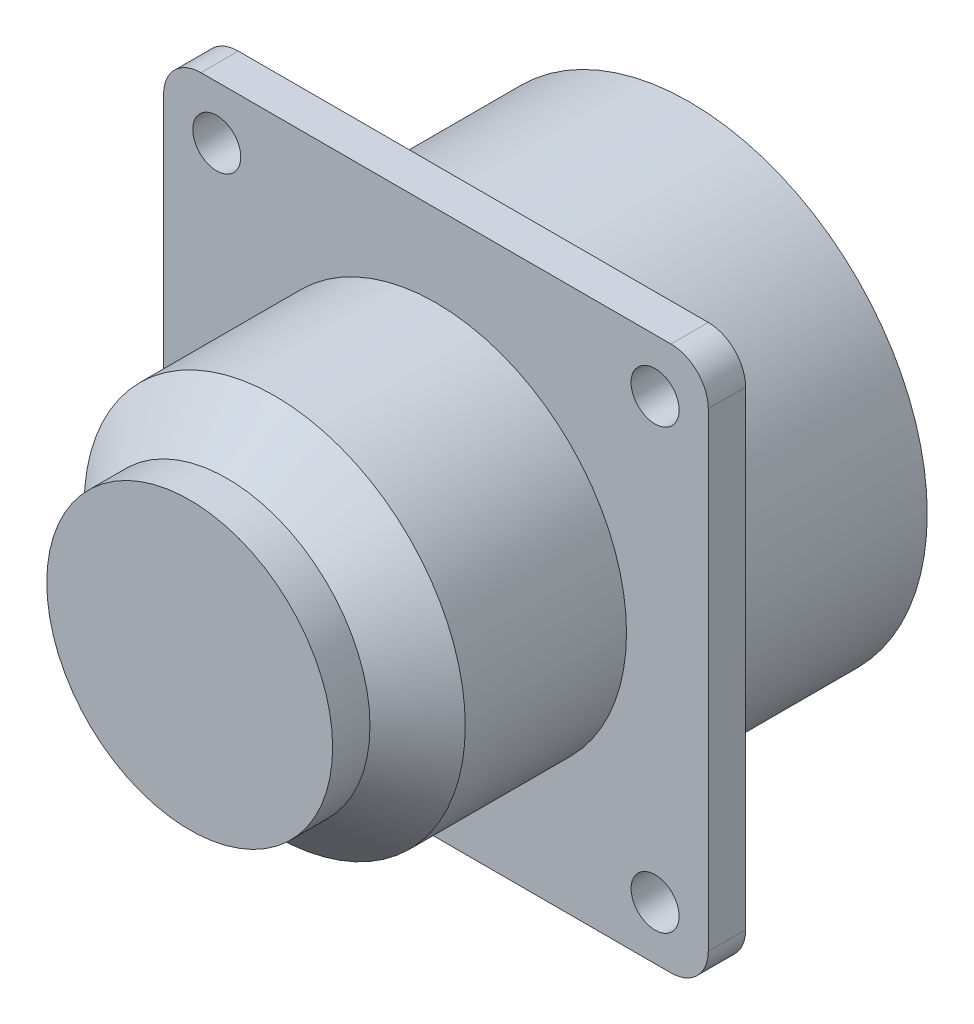
ISO-10303-21;
HEADER;
FILE_DESCRIPTION(('STEP AP214'),'2;1');
FILE_NAME('part.step','',(''),(''),'','','');
FILE_SCHEMA(('AUTOMOTIVE_DESIGN { 1 0 10303 214 1 1 1 1 }'));
ENDSEC;
DATA;
#1=APPLICATION_CONTEXT('core data for automotive mechanical design processes');
#2=APPLICATION_PROTOCOL_DEFINITION('international standard','automotive_design',2000,#1);
#3=PRODUCT_CONTEXT('',#1,'mechanical');
#4=PRODUCT('Part','Part','',(#3));
#5=PRODUCT_RELATED_PRODUCT_CATEGORY('part','',(#4));
#6=PRODUCT_DEFINITION_FORMATION('','',#4);
#7=PRODUCT_DEFINITION_CONTEXT('part definition',#1,'design');
#8=PRODUCT_DEFINITION('design','',#6,#7);
#9=PRODUCT_DEFINITION_SHAPE('','',#8);
#10=(LENGTH_UNIT() NAMED_UNIT(*) SI_UNIT(.MILLI.,.METRE.));
#11=(NAMED_UNIT(*) PLANE_ANGLE_UNIT() SI_UNIT($,.RADIAN.));
#12=(NAMED_UNIT(*) SI_UNIT($,.STERADIAN.) SOLID_ANGLE_UNIT());
#13=UNCERTAINTY_MEASURE_WITH_UNIT(LENGTH_MEASURE(1.E-05),#10,'distance_accuracy_value','');
#14=(GEOMETRIC_REPRESENTATION_CONTEXT(3) GLOBAL_UNCERTAINTY_ASSIGNED_CONTEXT((#13)) GLOBAL_UNIT_ASSIGNED_CONTEXT((#10,
#11,#12)) REPRESENTATION_CONTEXT('',''));
#15=CARTESIAN_POINT('',(0.,0.,0.));
#16=DIRECTION('',(0.,0.,1.));
#17=DIRECTION('',(1.,0.,0.));
#18=AXIS2_PLACEMENT_3D('',#15,#16,#17);
#19=CARTESIAN_POINT('',(0.,25.4,2.4892));
#20=DIRECTION('',(0.,0.,1.));
#21=DIRECTION('',(1.,0.,0.));
#22=AXIS2_PLACEMENT_3D('',#19,#20,#21);
#23=PLANE('',#22);
#24=CARTESIAN_POINT('',(-14.605,-14.605,2.4892));
#25=DIRECTION('',(0.,0.,1.));
#26=DIRECTION('',(1.,0.,0.));
#27=AXIS2_PLACEMENT_3D('',#24,#25,#26);
#28=CIRCLE('',#27,1.6002);
#29=CARTESIAN_POINT('',(-13.0048,-14.605,2.4892));
#30=VERTEX_POINT('',#29);
#31=EDGE_CURVE('E205',#30,#30,#28,.F.);
#32=ORIENTED_EDGE('',*,*,#31,.T.);
#33=EDGE_LOOP('',(#32));
#34=FACE_BOUND('',#33,.T.);
#35=CARTESIAN_POINT('',(-14.605,14.605,2.4892));
#36=DIRECTION('',(0.,0.,1.));
#37=DIRECTION('',(1.,0.,0.));
#38=AXIS2_PLACEMENT_3D('',#35,#36,#37);
#39=CIRCLE('',#38,1.6002);
#40=CARTESIAN_POINT('',(-13.0048,14.605,2.4892));
#41=VERTEX_POINT('',#40);
#42=EDGE_CURVE('E116',#41,#41,#39,.F.);
#43=ORIENTED_EDGE('',*,*,#42,.T.);
#44=EDGE_LOOP('',(#43));
#45=FACE_BOUND('',#44,.T.);
#46=CARTESIAN_POINT('',(15.6591,15.6591,2.4892));
#47=DIRECTION('',(0.,0.,1.));
#48=DIRECTION('',(1.,0.,0.));
#49=AXIS2_PLACEMENT_3D('',#46,#47,#48);
#50=CIRCLE('',#49,2.4892);
#51=CARTESIAN_POINT('',(15.6591,18.1483,2.4892));
#52=VERTEX_POINT('',#51);
#53=CARTESIAN_POINT('',(18.1483,15.6591,2.4892));
#54=VERTEX_POINT('',#53);
#55=EDGE_CURVE('E163',#52,#54,#50,.F.);
#56=ORIENTED_EDGE('',*,*,#55,.F.);
#57=DIRECTION('',(1.,0.,0.));
#58=VECTOR('',#57,1.);
#59=CARTESIAN_POINT('',(0.,18.1483,2.4892));
#60=LINE('',#59,#58);
#61=CARTESIAN_POINT('',(-15.6591,18.1483,2.4892));
#62=VERTEX_POINT('',#61);
#63=EDGE_CURVE('E105',#62,#52,#60,.T.);
#64=ORIENTED_EDGE('',*,*,#63,.F.);
#65=CARTESIAN_POINT('',(-15.6591,15.6591,2.4892));
#66=DIRECTION('',(0.,0.,1.));
#67=DIRECTION('',(1.,0.,0.));
#68=AXIS2_PLACEMENT_3D('',#65,#66,#67);
#69=CIRCLE('',#68,2.4892);
#70=CARTESIAN_POINT('',(-18.1483,15.6591,2.4892));
#71=VERTEX_POINT('',#70);
#72=EDGE_CURVE('E160',#71,#62,#69,.F.);
#73=ORIENTED_EDGE('',*,*,#72,.F.);
#74=DIRECTION('',(0.,1.,0.));
#75=VECTOR('',#74,1.);
#76=CARTESIAN_POINT('',(-18.1483,25.4,2.4892));
#77=LINE('',#76,#75);
#78=CARTESIAN_POINT('',(-18.1483,-15.6591,2.4892));
#79=VERTEX_POINT('',#78);
#80=EDGE_CURVE('E158',#79,#71,#77,.T.);
#81=ORIENTED_EDGE('',*,*,#80,.F.);
#82=CARTESIAN_POINT('',(-15.6591,-15.6591,2.4892));
#83=DIRECTION('',(0.,0.,1.));
#84=DIRECTION('',(1.,0.,0.));
#85=AXIS2_PLACEMENT_3D('',#82,#83,#84);
#86=CIRCLE('',#85,2.4892);
#87=CARTESIAN_POINT('',(-15.6591,-18.1483,2.4892));
#88=VERTEX_POINT('',#87);
#89=EDGE_CURVE('E156',#88,#79,#86,.F.);
#90=ORIENTED_EDGE('',*,*,#89,.F.);
#91=DIRECTION('',(-1.,0.,0.));
#92=VECTOR('',#91,1.);
#93=CARTESIAN_POINT('',(0.,-18.1483,2.4892));
#94=LINE('',#93,#92);
#95=CARTESIAN_POINT('',(15.6591,-18.1483,2.4892));
#96=VERTEX_POINT('',#95);
#97=EDGE_CURVE('E154',#96,#88,#94,.T.);
#98=ORIENTED_EDGE('',*,*,#97,.F.);
#99=CARTESIAN_POINT('',(15.6591,-15.6591,2.4892));
#100=DIRECTION('',(0.,0.,1.));
#101=DIRECTION('',(1.,0.,0.));
#102=AXIS2_PLACEMENT_3D('',#99,#100,#101);
#103=CIRCLE('',#102,2.48919999999999);
#104=CARTESIAN_POINT('',(18.1483,-15.6591,2.4892));
#105=VERTEX_POINT('',#104);
#106=EDGE_CURVE('E152',#105,#96,#103,.F.);
#107=ORIENTED_EDGE('',*,*,#106,.F.);
#108=DIRECTION('',(0.,-1.,0.));
#109=VECTOR('',#108,1.);
#110=CARTESIAN_POINT('',(18.1483,25.4,2.4892));
#111=LINE('',#110,#109);
#112=EDGE_CURVE('E108',#54,#105,#111,.T.);
#113=ORIENTED_EDGE('',*,*,#112,.F.);
#114=EDGE_LOOP('',(#56,#64,#73,#81,#90,#98,#107,#113));
#115=FACE_BOUND('',#114,.T.);
#116=CARTESIAN_POINT('',(0.,0.,2.4892));
#117=DIRECTION('',(0.,0.,-1.));
#118=DIRECTION('',(-1.,0.,0.));
#119=AXIS2_PLACEMENT_3D('',#116,#117,#118);
#120=CIRCLE('',#119,12.7);
#121=CARTESIAN_POINT('',(-12.7,0.,2.4892));
#122=VERTEX_POINT('',#121);
#123=EDGE_CURVE('E165',#122,#122,#120,.T.);
#124=ORIENTED_EDGE('',*,*,#123,.T.);
#125=EDGE_LOOP('',(#124));
#126=FACE_BOUND('',#125,.T.);
#127=CARTESIAN_POINT('',(14.605,14.605,2.4892));
#128=DIRECTION('',(0.,0.,1.));
#129=DIRECTION('',(1.,0.,0.));
#130=AXIS2_PLACEMENT_3D('',#127,#128,#129);
#131=CIRCLE('',#130,1.6002);
#132=CARTESIAN_POINT('',(16.2052,14.605,2.4892));
#133=VERTEX_POINT('',#132);
#134=EDGE_CURVE('E216',#133,#133,#131,.F.);
#135=ORIENTED_EDGE('',*,*,#134,.T.);
#136=EDGE_LOOP('',(#135));
#137=FACE_BOUND('',#136,.T.);
#138=CARTESIAN_POINT('',(14.605,-14.605,2.4892));
#139=DIRECTION('',(0.,0.,1.));
#140=DIRECTION('',(1.,0.,0.));
#141=AXIS2_PLACEMENT_3D('',#138,#139,#140);
#142=CIRCLE('',#141,1.6002);
#143=CARTESIAN_POINT('',(16.2052,-14.605,2.4892));
#144=VERTEX_POINT('',#143);
#145=EDGE_CURVE('E219',#144,#144,#142,.F.);
#146=ORIENTED_EDGE('',*,*,#145,.T.);
#147=EDGE_LOOP('',(#146));
#148=FACE_BOUND('',#147,.T.);
#149=ADVANCED_FACE('F32',(#34,#45,#115,#126,#137,#148),#23,.T.);
#150=CARTESIAN_POINT('',(0.,25.4,0.));
#151=DIRECTION('',(0.,0.,-1.));
#152=DIRECTION('',(-1.,0.,0.));
#153=AXIS2_PLACEMENT_3D('',#150,#151,#152);
#154=PLANE('',#153);
#155=CARTESIAN_POINT('',(-14.605,-14.605,0.));
#156=DIRECTION('',(0.,0.,1.));
#157=DIRECTION('',(-1.,0.,0.));
#158=AXIS2_PLACEMENT_3D('',#155,#156,#157);
#159=CIRCLE('',#158,1.6002);
#160=CARTESIAN_POINT('',(-16.2052,-14.605,0.));
#161=VERTEX_POINT('',#160);
#162=EDGE_CURVE('E221',#161,#161,#159,.T.);
#163=ORIENTED_EDGE('',*,*,#162,.T.);
#164=EDGE_LOOP('',(#163));
#165=FACE_BOUND('',#164,.T.);
#166=CARTESIAN_POINT('',(-14.605,14.605,0.));
#167=DIRECTION('',(0.,0.,1.));
#168=DIRECTION('',(1.,0.,0.));
#169=AXIS2_PLACEMENT_3D('',#166,#167,#168);
#170=CIRCLE('',#169,1.6002);
#171=CARTESIAN_POINT('',(-13.0048,14.605,0.));
#172=VERTEX_POINT('',#171);
#173=EDGE_CURVE('E234',#172,#172,#170,.T.);
#174=ORIENTED_EDGE('',*,*,#173,.T.);
#175=EDGE_LOOP('',(#174));
#176=FACE_BOUND('',#175,.T.);
#177=CARTESIAN_POINT('',(15.6591,15.6591,0.));
#178=DIRECTION('',(0.,0.,1.));
#179=DIRECTION('',(-1.,0.,0.));
#180=AXIS2_PLACEMENT_3D('',#177,#178,#179);
#181=CIRCLE('',#180,2.4892);
#182=CARTESIAN_POINT('',(18.1483,15.6591,0.));
#183=VERTEX_POINT('',#182);
#184=CARTESIAN_POINT('',(15.6591,18.1483,0.));
#185=VERTEX_POINT('',#184);
#186=EDGE_CURVE('E112',#183,#185,#181,.T.);
#187=ORIENTED_EDGE('',*,*,#186,.F.);
#188=DIRECTION('',(0.,1.,0.));
#189=VECTOR('',#188,1.);
#190=CARTESIAN_POINT('',(18.1483,15.6591,0.));
#191=LINE('',#190,#189);
#192=CARTESIAN_POINT('',(18.1483,-15.6591,0.));
#193=VERTEX_POINT('',#192);
#194=EDGE_CURVE('E137',#193,#183,#191,.T.);
#195=ORIENTED_EDGE('',*,*,#194,.F.);
#196=CARTESIAN_POINT('',(15.6591,-15.6591,0.));
#197=DIRECTION('',(0.,0.,1.));
#198=DIRECTION('',(1.,0.,0.));
#199=AXIS2_PLACEMENT_3D('',#196,#197,#198);
#200=CIRCLE('',#199,2.48919999999999);
#201=CARTESIAN_POINT('',(15.6591,-18.1483,0.));
#202=VERTEX_POINT('',#201);
#203=EDGE_CURVE('E54',#202,#193,#200,.T.);
#204=ORIENTED_EDGE('',*,*,#203,.F.);
#205=DIRECTION('',(1.,0.,0.));
#206=VECTOR('',#205,1.);
#207=CARTESIAN_POINT('',(-15.6591,-18.1483,0.));
#208=LINE('',#207,#206);
#209=CARTESIAN_POINT('',(-15.6591,-18.1483,0.));
#210=VERTEX_POINT('',#209);
#211=EDGE_CURVE('E133',#210,#202,#208,.T.);
#212=ORIENTED_EDGE('',*,*,#211,.F.);
#213=CARTESIAN_POINT('',(-15.6591,-15.6591,0.));
#214=DIRECTION('',(0.,0.,1.));
#215=DIRECTION('',(1.,0.,0.));
#216=AXIS2_PLACEMENT_3D('',#213,#214,#215);
#217=CIRCLE('',#216,2.4892);
#218=CARTESIAN_POINT('',(-18.1483,-15.6591,0.));
#219=VERTEX_POINT('',#218);
#220=EDGE_CURVE('E130',#219,#210,#217,.T.);
#221=ORIENTED_EDGE('',*,*,#220,.F.);
#222=DIRECTION('',(0.,-1.,0.));
#223=VECTOR('',#222,1.);
#224=CARTESIAN_POINT('',(-18.1483,15.6591,0.));
#225=LINE('',#224,#223);
#226=CARTESIAN_POINT('',(-18.1483,15.6591,0.));
#227=VERTEX_POINT('',#226);
#228=EDGE_CURVE('E124',#227,#219,#225,.T.);
#229=ORIENTED_EDGE('',*,*,#228,.F.);
#230=CARTESIAN_POINT('',(-15.6591,15.6591,0.));
#231=DIRECTION('',(0.,0.,1.));
#232=DIRECTION('',(1.,0.,0.));
#233=AXIS2_PLACEMENT_3D('',#230,#231,#232);
#234=CIRCLE('',#233,2.4892);
#235=CARTESIAN_POINT('',(-15.6591,18.1483,0.));
#236=VERTEX_POINT('',#235);
#237=EDGE_CURVE('E122',#236,#227,#234,.T.);
#238=ORIENTED_EDGE('',*,*,#237,.F.);
#239=DIRECTION('',(-1.,0.,0.));
#240=VECTOR('',#239,1.);
#241=CARTESIAN_POINT('',(-15.6591,18.1483,0.));
#242=LINE('',#241,#240);
#243=EDGE_CURVE('E102',#185,#236,#242,.T.);
#244=ORIENTED_EDGE('',*,*,#243,.F.);
#245=EDGE_LOOP('',(#187,#195,#204,#212,#221,#229,#238,#244));
#246=FACE_BOUND('',#245,.T.);
#247=CARTESIAN_POINT('',(0.,0.,0.));
#248=DIRECTION('',(0.,0.,-1.));
#249=DIRECTION('',(-1.,0.,0.));
#250=AXIS2_PLACEMENT_3D('',#247,#248,#249);
#251=CIRCLE('',#250,15.8496);
#252=CARTESIAN_POINT('',(-15.8496,0.,0.));
#253=VERTEX_POINT('',#252);
#254=EDGE_CURVE('E12',#253,#253,#251,.T.);
#255=ORIENTED_EDGE('',*,*,#254,.F.);
#256=EDGE_LOOP('',(#255));
#257=FACE_BOUND('',#256,.T.);
#258=CARTESIAN_POINT('',(14.605,14.605,0.));
#259=DIRECTION('',(0.,0.,1.));
#260=DIRECTION('',(-1.,0.,0.));
#261=AXIS2_PLACEMENT_3D('',#258,#259,#260);
#262=CIRCLE('',#261,1.6002);
#263=CARTESIAN_POINT('',(13.0048,14.605,0.));
#264=VERTEX_POINT('',#263);
#265=EDGE_CURVE('E230',#264,#264,#262,.T.);
#266=ORIENTED_EDGE('',*,*,#265,.T.);
#267=EDGE_LOOP('',(#266));
#268=FACE_BOUND('',#267,.T.);
#269=CARTESIAN_POINT('',(14.605,-14.605,0.));
#270=DIRECTION('',(0.,0.,1.));
#271=DIRECTION('',(1.,0.,0.));
#272=AXIS2_PLACEMENT_3D('',#269,#270,#271);
#273=CIRCLE('',#272,1.6002);
#274=CARTESIAN_POINT('',(16.2052,-14.605,0.));
#275=VERTEX_POINT('',#274);
#276=EDGE_CURVE('E222',#275,#275,#273,.T.);
#277=ORIENTED_EDGE('',*,*,#276,.T.);
#278=EDGE_LOOP('',(#277));
#279=FACE_BOUND('',#278,.T.);
#280=ADVANCED_FACE('F118',(#165,#176,#246,#257,#268,#279),#154,.T.);
#281=CARTESIAN_POINT('',(0.,9.525,18.8976));
#282=DIRECTION('',(0.,0.,1.));
#283=DIRECTION('',(1.,0.,0.));
#284=AXIS2_PLACEMENT_3D('',#281,#282,#283);
#285=PLANE('',#284);
#286=CARTESIAN_POINT('',(0.,0.,18.8976));
#287=DIRECTION('',(0.,0.,-1.));
#288=DIRECTION('',(-1.,0.,0.));
#289=AXIS2_PLACEMENT_3D('',#286,#287,#288);
#290=CIRCLE('',#289,9.525);
#291=CARTESIAN_POINT('',(-9.525,0.,18.8976));
#292=VERTEX_POINT('',#291);
#293=EDGE_CURVE('E174',#292,#292,#290,.T.);
#294=ORIENTED_EDGE('',*,*,#293,.F.);
#295=EDGE_LOOP('',(#294));
#296=FACE_BOUND('',#295,.T.);
#297=ADVANCED_FACE('F200',(#296),#285,.T.);
#298=CARTESIAN_POINT('',(0.,0.,0.));
#299=DIRECTION('',(0.,0.,-1.));
#300=DIRECTION('',(-1.,0.,0.));
#301=AXIS2_PLACEMENT_3D('',#298,#299,#300);
#302=CYLINDRICAL_SURFACE('',#301,9.525);
#303=ORIENTED_EDGE('',*,*,#293,.T.);
#304=EDGE_LOOP('',(#303));
#305=FACE_BOUND('',#304,.T.);
#306=CARTESIAN_POINT('',(0.,0.,16.4084));
#307=DIRECTION('',(0.,0.,-1.));
#308=DIRECTION('',(-1.,0.,0.));
#309=AXIS2_PLACEMENT_3D('',#306,#307,#308);
#310=CIRCLE('',#309,9.525);
#311=CARTESIAN_POINT('',(-9.525,0.,16.4084));
#312=VERTEX_POINT('',#311);
#313=EDGE_CURVE('E171',#312,#312,#310,.T.);
#314=ORIENTED_EDGE('',*,*,#313,.F.);
#315=EDGE_LOOP('',(#314));
#316=FACE_BOUND('',#315,.T.);
#317=ADVANCED_FACE('F287',(#305,#316),#302,.T.);
#318=CARTESIAN_POINT('',(0.,0.,13.2334));
#319=DIRECTION('',(0.,0.,-1.));
#320=DIRECTION('',(-1.,0.,0.));
#321=AXIS2_PLACEMENT_3D('',#318,#319,#320);
#322=CONICAL_SURFACE('',#321,12.7,0.78539816339745);
#323=ORIENTED_EDGE('',*,*,#313,.T.);
#324=EDGE_LOOP('',(#323));
#325=FACE_BOUND('',#324,.T.);
#326=CARTESIAN_POINT('',(0.,0.,13.2334));
#327=DIRECTION('',(0.,0.,-1.));
#328=DIRECTION('',(-1.,0.,0.));
#329=AXIS2_PLACEMENT_3D('',#326,#327,#328);
#330=CIRCLE('',#329,12.7);
#331=CARTESIAN_POINT('',(-12.7,0.,13.2334));
#332=VERTEX_POINT('',#331);
#333=EDGE_CURVE('E168',#332,#332,#330,.T.);
#334=ORIENTED_EDGE('',*,*,#333,.F.);
#335=EDGE_LOOP('',(#334));
#336=FACE_BOUND('',#335,.T.);
#337=ADVANCED_FACE('F283',(#325,#336),#322,.T.);
#338=CARTESIAN_POINT('',(0.,0.,0.));
#339=DIRECTION('',(0.,0.,-1.));
#340=DIRECTION('',(-1.,0.,0.));
#341=AXIS2_PLACEMENT_3D('',#338,#339,#340);
#342=CYLINDRICAL_SURFACE('',#341,12.7);
#343=ORIENTED_EDGE('',*,*,#333,.T.);
#344=EDGE_LOOP('',(#343));
#345=FACE_BOUND('',#344,.T.);
#346=ORIENTED_EDGE('',*,*,#123,.F.);
#347=EDGE_LOOP('',(#346));
#348=FACE_BOUND('',#347,.T.);
#349=ADVANCED_FACE('F280',(#345,#348),#342,.T.);
#350=CARTESIAN_POINT('',(15.6591,15.6591,18.8976));
#351=DIRECTION('',(0.,0.,-1.));
#352=DIRECTION('',(-1.,0.,0.));
#353=AXIS2_PLACEMENT_3D('',#350,#351,#352);
#354=CYLINDRICAL_SURFACE('',#353,2.4892);
#355=ORIENTED_EDGE('',*,*,#55,.T.);
#356=DIRECTION('',(0.,0.,-1.));
#357=VECTOR('',#356,1.);
#358=CARTESIAN_POINT('',(18.1483,15.6591,18.8976));
#359=LINE('',#358,#357);
#360=EDGE_CURVE('E46',#54,#183,#359,.T.);
#361=ORIENTED_EDGE('',*,*,#360,.T.);
#362=ORIENTED_EDGE('',*,*,#186,.T.);
#363=DIRECTION('',(0.,0.,-1.));
#364=VECTOR('',#363,1.);
#365=CARTESIAN_POINT('',(15.6591,18.1483,18.8976));
#366=LINE('',#365,#364);
#367=EDGE_CURVE('E97',#52,#185,#366,.T.);
#368=ORIENTED_EDGE('',*,*,#367,.F.);
#369=EDGE_LOOP('',(#355,#361,#362,#368));
#370=FACE_BOUND('',#369,.T.);
#371=ADVANCED_FACE('F113',(#370),#354,.T.);
#372=CARTESIAN_POINT('',(-15.6591,18.1483,18.8976));
#373=DIRECTION('',(0.,-1.,0.));
#374=DIRECTION('',(0.,0.,-1.));
#375=AXIS2_PLACEMENT_3D('',#372,#373,#374);
#376=PLANE('',#375);
#377=ORIENTED_EDGE('',*,*,#63,.T.);
#378=ORIENTED_EDGE('',*,*,#367,.T.);
#379=ORIENTED_EDGE('',*,*,#243,.T.);
#380=DIRECTION('',(0.,0.,-1.));
#381=VECTOR('',#380,1.);
#382=CARTESIAN_POINT('',(-15.6591,18.1483,18.8976));
#383=LINE('',#382,#381);
#384=EDGE_CURVE('E109',#62,#236,#383,.T.);
#385=ORIENTED_EDGE('',*,*,#384,.F.);
#386=EDGE_LOOP('',(#377,#378,#379,#385));
#387=FACE_BOUND('',#386,.T.);
#388=ADVANCED_FACE('F99',(#387),#376,.F.);
#389=CARTESIAN_POINT('',(-15.6591,15.6591,18.8976));
#390=DIRECTION('',(0.,0.,-1.));
#391=DIRECTION('',(-1.,0.,0.));
#392=AXIS2_PLACEMENT_3D('',#389,#390,#391);
#393=CYLINDRICAL_SURFACE('',#392,2.4892);
#394=ORIENTED_EDGE('',*,*,#72,.T.);
#395=ORIENTED_EDGE('',*,*,#384,.T.);
#396=ORIENTED_EDGE('',*,*,#237,.T.);
#397=DIRECTION('',(0.,0.,-1.));
#398=VECTOR('',#397,1.);
#399=CARTESIAN_POINT('',(-18.1483,15.6591,18.8976));
#400=LINE('',#399,#398);
#401=EDGE_CURVE('E148',#71,#227,#400,.T.);
#402=ORIENTED_EDGE('',*,*,#401,.F.);
#403=EDGE_LOOP('',(#394,#395,#396,#402));
#404=FACE_BOUND('',#403,.T.);
#405=ADVANCED_FACE('F271',(#404),#393,.T.);
#406=CARTESIAN_POINT('',(-18.1483,15.6591,18.8976));
#407=DIRECTION('',(1.,0.,0.));
#408=DIRECTION('',(0.,1.,0.));
#409=AXIS2_PLACEMENT_3D('',#406,#407,#408);
#410=PLANE('',#409);
#411=ORIENTED_EDGE('',*,*,#80,.T.);
#412=ORIENTED_EDGE('',*,*,#401,.T.);
#413=ORIENTED_EDGE('',*,*,#228,.T.);
#414=DIRECTION('',(0.,0.,-1.));
#415=VECTOR('',#414,1.);
#416=CARTESIAN_POINT('',(-18.1483,-15.6591,18.8976));
#417=LINE('',#416,#415);
#418=EDGE_CURVE('E146',#79,#219,#417,.T.);
#419=ORIENTED_EDGE('',*,*,#418,.F.);
#420=EDGE_LOOP('',(#411,#412,#413,#419));
#421=FACE_BOUND('',#420,.T.);
#422=ADVANCED_FACE('F267',(#421),#410,.F.);
#423=CARTESIAN_POINT('',(-15.6591,-15.6591,18.8976));
#424=DIRECTION('',(0.,0.,-1.));
#425=DIRECTION('',(-1.,0.,0.));
#426=AXIS2_PLACEMENT_3D('',#423,#424,#425);
#427=CYLINDRICAL_SURFACE('',#426,2.4892);
#428=ORIENTED_EDGE('',*,*,#89,.T.);
#429=ORIENTED_EDGE('',*,*,#418,.T.);
#430=ORIENTED_EDGE('',*,*,#220,.T.);
#431=DIRECTION('',(0.,0.,-1.));
#432=VECTOR('',#431,1.);
#433=CARTESIAN_POINT('',(-15.6591,-18.1483,18.8976));
#434=LINE('',#433,#432);
#435=EDGE_CURVE('E144',#88,#210,#434,.T.);
#436=ORIENTED_EDGE('',*,*,#435,.F.);
#437=EDGE_LOOP('',(#428,#429,#430,#436));
#438=FACE_BOUND('',#437,.T.);
#439=ADVANCED_FACE('F263',(#438),#427,.T.);
#440=CARTESIAN_POINT('',(-15.6591,-18.1483,18.8976));
#441=DIRECTION('',(0.,1.,0.));
#442=DIRECTION('',(0.,0.,1.));
#443=AXIS2_PLACEMENT_3D('',#440,#441,#442);
#444=PLANE('',#443);
#445=ORIENTED_EDGE('',*,*,#97,.T.);
#446=ORIENTED_EDGE('',*,*,#435,.T.);
#447=ORIENTED_EDGE('',*,*,#211,.T.);
#448=DIRECTION('',(0.,0.,-1.));
#449=VECTOR('',#448,1.);
#450=CARTESIAN_POINT('',(15.6591,-18.1483,18.8976));
#451=LINE('',#450,#449);
#452=EDGE_CURVE('E142',#96,#202,#451,.T.);
#453=ORIENTED_EDGE('',*,*,#452,.F.);
#454=EDGE_LOOP('',(#445,#446,#447,#453));
#455=FACE_BOUND('',#454,.T.);
#456=ADVANCED_FACE('F260',(#455),#444,.F.);
#457=CARTESIAN_POINT('',(15.6591,-15.6591,18.8976));
#458=DIRECTION('',(0.,0.,-1.));
#459=DIRECTION('',(-1.,0.,0.));
#460=AXIS2_PLACEMENT_3D('',#457,#458,#459);
#461=CYLINDRICAL_SURFACE('',#460,2.48919999999999);
#462=ORIENTED_EDGE('',*,*,#106,.T.);
#463=ORIENTED_EDGE('',*,*,#452,.T.);
#464=ORIENTED_EDGE('',*,*,#203,.T.);
#465=DIRECTION('',(0.,0.,-1.));
#466=VECTOR('',#465,1.);
#467=CARTESIAN_POINT('',(18.1483,-15.6591,18.8976));
#468=LINE('',#467,#466);
#469=EDGE_CURVE('E140',#105,#193,#468,.T.);
#470=ORIENTED_EDGE('',*,*,#469,.F.);
#471=EDGE_LOOP('',(#462,#463,#464,#470));
#472=FACE_BOUND('',#471,.T.);
#473=ADVANCED_FACE('F257',(#472),#461,.T.);
#474=CARTESIAN_POINT('',(18.1483,15.6591,18.8976));
#475=DIRECTION('',(-1.,0.,0.));
#476=DIRECTION('',(0.,-1.,0.));
#477=AXIS2_PLACEMENT_3D('',#474,#475,#476);
#478=PLANE('',#477);
#479=ORIENTED_EDGE('',*,*,#112,.T.);
#480=ORIENTED_EDGE('',*,*,#469,.T.);
#481=ORIENTED_EDGE('',*,*,#194,.T.);
#482=ORIENTED_EDGE('',*,*,#360,.F.);
#483=EDGE_LOOP('',(#479,#480,#481,#482));
#484=FACE_BOUND('',#483,.T.);
#485=ADVANCED_FACE('F193',(#484),#478,.F.);
#486=CARTESIAN_POINT('',(0.,15.8496,-14.4018));
#487=DIRECTION('',(0.,0.,-1.));
#488=DIRECTION('',(-1.,0.,0.));
#489=AXIS2_PLACEMENT_3D('',#486,#487,#488);
#490=PLANE('',#489);
#491=CARTESIAN_POINT('',(0.,0.,-14.4018));
#492=DIRECTION('',(0.,0.,-1.));
#493=DIRECTION('',(-1.,0.,0.));
#494=AXIS2_PLACEMENT_3D('',#491,#492,#493);
#495=CIRCLE('',#494,15.8496);
#496=CARTESIAN_POINT('',(-15.8496,0.,-14.4018));
#497=VERTEX_POINT('',#496);
#498=EDGE_CURVE('E39',#497,#497,#495,.T.);
#499=ORIENTED_EDGE('',*,*,#498,.T.);
#500=EDGE_LOOP('',(#499));
#501=FACE_BOUND('',#500,.T.);
#502=ADVANCED_FACE('F179',(#501),#490,.T.);
#503=CARTESIAN_POINT('',(0.,0.,0.));
#504=DIRECTION('',(0.,0.,-1.));
#505=DIRECTION('',(-1.,0.,0.));
#506=AXIS2_PLACEMENT_3D('',#503,#504,#505);
#507=CYLINDRICAL_SURFACE('',#506,15.8496);
#508=ORIENTED_EDGE('',*,*,#254,.T.);
#509=EDGE_LOOP('',(#508));
#510=FACE_BOUND('',#509,.T.);
#511=ORIENTED_EDGE('',*,*,#498,.F.);
#512=EDGE_LOOP('',(#511));
#513=FACE_BOUND('',#512,.T.);
#514=ADVANCED_FACE('F181',(#510,#513),#507,.T.);
#515=CARTESIAN_POINT('',(-14.605,14.605,18.8976));
#516=DIRECTION('',(0.,0.,-1.));
#517=DIRECTION('',(-1.,0.,0.));
#518=AXIS2_PLACEMENT_3D('',#515,#516,#517);
#519=CYLINDRICAL_SURFACE('',#518,1.6002);
#520=ORIENTED_EDGE('',*,*,#42,.F.);
#521=EDGE_LOOP('',(#520));
#522=FACE_BOUND('',#521,.T.);
#523=ORIENTED_EDGE('',*,*,#173,.F.);
#524=EDGE_LOOP('',(#523));
#525=FACE_BOUND('',#524,.T.);
#526=ADVANCED_FACE('F183',(#522,#525),#519,.F.);
#527=CARTESIAN_POINT('',(14.605,14.605,18.8976));
#528=DIRECTION('',(0.,0.,-1.));
#529=DIRECTION('',(-1.,0.,0.));
#530=AXIS2_PLACEMENT_3D('',#527,#528,#529);
#531=CYLINDRICAL_SURFACE('',#530,1.6002);
#532=ORIENTED_EDGE('',*,*,#134,.F.);
#533=EDGE_LOOP('',(#532));
#534=FACE_BOUND('',#533,.T.);
#535=ORIENTED_EDGE('',*,*,#265,.F.);
#536=EDGE_LOOP('',(#535));
#537=FACE_BOUND('',#536,.T.);
#538=ADVANCED_FACE('F190',(#534,#537),#531,.F.);
#539=CARTESIAN_POINT('',(-14.605,-14.605,18.8976));
#540=DIRECTION('',(0.,0.,-1.));
#541=DIRECTION('',(-1.,0.,0.));
#542=AXIS2_PLACEMENT_3D('',#539,#540,#541);
#543=CYLINDRICAL_SURFACE('',#542,1.6002);
#544=ORIENTED_EDGE('',*,*,#31,.F.);
#545=EDGE_LOOP('',(#544));
#546=FACE_BOUND('',#545,.T.);
#547=ORIENTED_EDGE('',*,*,#162,.F.);
#548=EDGE_LOOP('',(#547));
#549=FACE_BOUND('',#548,.T.);
#550=ADVANCED_FACE('F244',(#546,#549),#543,.F.);
#551=CARTESIAN_POINT('',(14.605,-14.605,18.8976));
#552=DIRECTION('',(0.,0.,-1.));
#553=DIRECTION('',(-1.,0.,0.));
#554=AXIS2_PLACEMENT_3D('',#551,#552,#553);
#555=CYLINDRICAL_SURFACE('',#554,1.6002);
#556=ORIENTED_EDGE('',*,*,#145,.F.);
#557=EDGE_LOOP('',(#556));
#558=FACE_BOUND('',#557,.T.);
#559=ORIENTED_EDGE('',*,*,#276,.F.);
#560=EDGE_LOOP('',(#559));
#561=FACE_BOUND('',#560,.T.);
#562=ADVANCED_FACE('F250',(#558,#561),#555,.F.);
#563=CLOSED_SHELL('',(#149,#280,#297,#317,#337,#349,#371,#388,#405,#422,#439,#456,#473,#485,
#502,#514,#526,#538,#550,#562));
#564=MANIFOLD_SOLID_BREP('B2',#563);
#565=ADVANCED_BREP_SHAPE_REPRESENTATION('',(#18,#564),#14);
#566=SHAPE_DEFINITION_REPRESENTATION(#9,#565);
ENDSEC;
END-ISO-10303-21;
